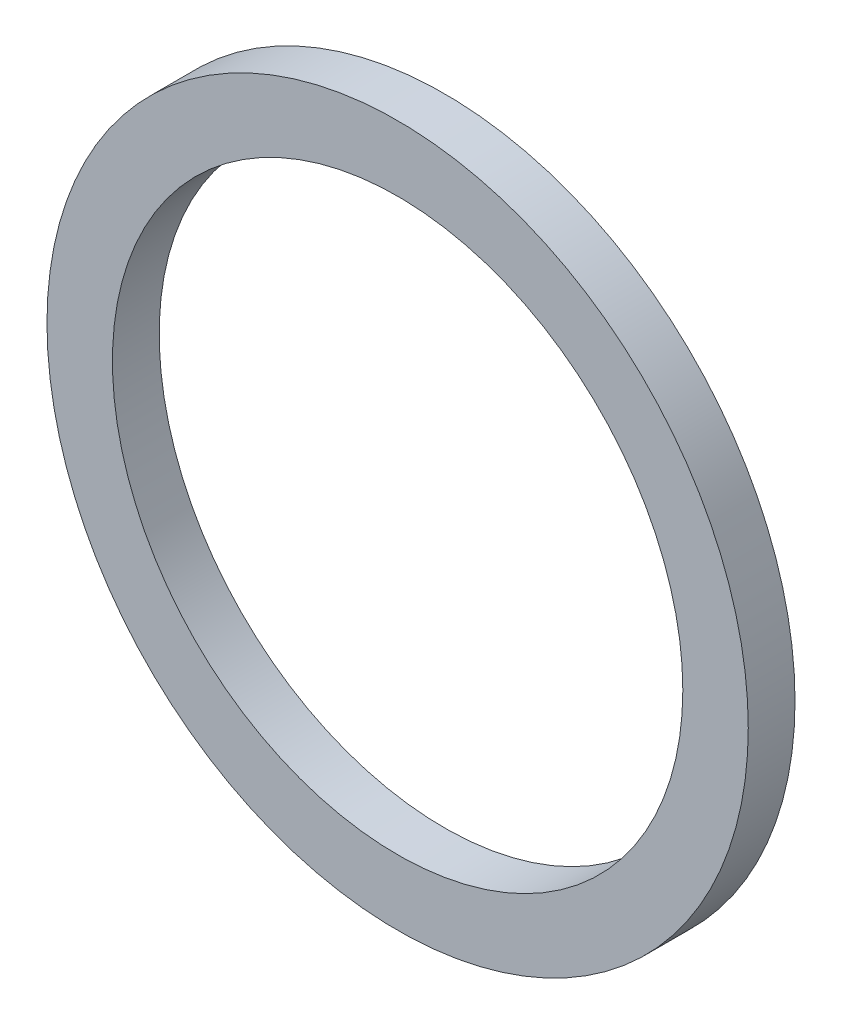
ISO-10303-21;
HEADER;
FILE_DESCRIPTION(('STEP AP214'),'2;1');
FILE_NAME('part.step','',(''),(''),'','','');
FILE_SCHEMA(('AUTOMOTIVE_DESIGN { 1 0 10303 214 1 1 1 1 }'));
ENDSEC;
DATA;
#1=APPLICATION_CONTEXT('core data for automotive mechanical design processes');
#2=APPLICATION_PROTOCOL_DEFINITION('international standard','automotive_design',2000,#1);
#3=PRODUCT_CONTEXT('',#1,'mechanical');
#4=PRODUCT('Part','Part','',(#3));
#5=PRODUCT_RELATED_PRODUCT_CATEGORY('part','',(#4));
#6=PRODUCT_DEFINITION_FORMATION('','',#4);
#7=PRODUCT_DEFINITION_CONTEXT('part definition',#1,'design');
#8=PRODUCT_DEFINITION('design','',#6,#7);
#9=PRODUCT_DEFINITION_SHAPE('','',#8);
#10=(LENGTH_UNIT() NAMED_UNIT(*) SI_UNIT(.MILLI.,.METRE.));
#11=(NAMED_UNIT(*) PLANE_ANGLE_UNIT() SI_UNIT($,.RADIAN.));
#12=(NAMED_UNIT(*) SI_UNIT($,.STERADIAN.) SOLID_ANGLE_UNIT());
#13=UNCERTAINTY_MEASURE_WITH_UNIT(LENGTH_MEASURE(1.E-05),#10,'distance_accuracy_value','');
#14=(GEOMETRIC_REPRESENTATION_CONTEXT(3) GLOBAL_UNCERTAINTY_ASSIGNED_CONTEXT((#13)) GLOBAL_UNIT_ASSIGNED_CONTEXT((#10,
#11,#12)) REPRESENTATION_CONTEXT('',''));
#15=CARTESIAN_POINT('',(0.,0.,0.));
#16=DIRECTION('',(0.,0.,1.));
#17=DIRECTION('',(1.,0.,0.));
#18=AXIS2_PLACEMENT_3D('',#15,#16,#17);
#19=CARTESIAN_POINT('',(0.,0.,2.));
#20=DIRECTION('',(0.,0.,1.));
#21=DIRECTION('',(1.,0.,0.));
#22=AXIS2_PLACEMENT_3D('',#19,#20,#21);
#23=PLANE('',#22);
#24=CARTESIAN_POINT('',(0.,0.,2.));
#25=DIRECTION('',(0.,0.,1.));
#26=DIRECTION('',(1.,0.,0.));
#27=AXIS2_PLACEMENT_3D('',#24,#25,#26);
#28=CIRCLE('',#27,15.);
#29=CARTESIAN_POINT('',(15.,0.,2.));
#30=VERTEX_POINT('',#29);
#31=EDGE_CURVE('E10',#30,#30,#28,.T.);
#32=ORIENTED_EDGE('',*,*,#31,.T.);
#33=EDGE_LOOP('',(#32));
#34=FACE_BOUND('',#33,.T.);
#35=CARTESIAN_POINT('',(0.,0.,2.));
#36=DIRECTION('',(0.,0.,1.));
#37=DIRECTION('',(1.,0.,0.));
#38=AXIS2_PLACEMENT_3D('',#35,#36,#37);
#39=CIRCLE('',#38,12.2);
#40=CARTESIAN_POINT('',(12.2,0.,2.));
#41=VERTEX_POINT('',#40);
#42=EDGE_CURVE('E43',#41,#41,#39,.T.);
#43=ORIENTED_EDGE('',*,*,#42,.F.);
#44=EDGE_LOOP('',(#43));
#45=FACE_BOUND('',#44,.T.);
#46=ADVANCED_FACE('F32',(#34,#45),#23,.T.);
#47=CARTESIAN_POINT('',(0.,0.,0.));
#48=DIRECTION('',(0.,0.,1.));
#49=DIRECTION('',(1.,0.,0.));
#50=AXIS2_PLACEMENT_3D('',#47,#48,#49);
#51=PLANE('',#50);
#52=CARTESIAN_POINT('',(0.,0.,0.));
#53=DIRECTION('',(0.,0.,1.));
#54=DIRECTION('',(1.,0.,0.));
#55=AXIS2_PLACEMENT_3D('',#52,#53,#54);
#56=CIRCLE('',#55,15.);
#57=CARTESIAN_POINT('',(15.,0.,0.));
#58=VERTEX_POINT('',#57);
#59=EDGE_CURVE('E36',#58,#58,#56,.T.);
#60=ORIENTED_EDGE('',*,*,#59,.F.);
#61=EDGE_LOOP('',(#60));
#62=FACE_BOUND('',#61,.T.);
#63=CARTESIAN_POINT('',(0.,0.,0.));
#64=DIRECTION('',(0.,0.,1.));
#65=DIRECTION('',(1.,0.,0.));
#66=AXIS2_PLACEMENT_3D('',#63,#64,#65);
#67=CIRCLE('',#66,12.2);
#68=CARTESIAN_POINT('',(12.2,0.,0.));
#69=VERTEX_POINT('',#68);
#70=EDGE_CURVE('E45',#69,#69,#67,.T.);
#71=ORIENTED_EDGE('',*,*,#70,.T.);
#72=EDGE_LOOP('',(#71));
#73=FACE_BOUND('',#72,.T.);
#74=ADVANCED_FACE('F55',(#62,#73),#51,.F.);
#75=CARTESIAN_POINT('',(0.,0.,2.));
#76=DIRECTION('',(0.,0.,-1.));
#77=DIRECTION('',(-1.,0.,0.));
#78=AXIS2_PLACEMENT_3D('',#75,#76,#77);
#79=CYLINDRICAL_SURFACE('',#78,15.);
#80=ORIENTED_EDGE('',*,*,#31,.F.);
#81=EDGE_LOOP('',(#80));
#82=FACE_BOUND('',#81,.T.);
#83=ORIENTED_EDGE('',*,*,#59,.T.);
#84=EDGE_LOOP('',(#83));
#85=FACE_BOUND('',#84,.T.);
#86=ADVANCED_FACE('F34',(#82,#85),#79,.T.);
#87=CARTESIAN_POINT('',(0.,0.,2.));
#88=DIRECTION('',(0.,0.,-1.));
#89=DIRECTION('',(-1.,0.,0.));
#90=AXIS2_PLACEMENT_3D('',#87,#88,#89);
#91=CYLINDRICAL_SURFACE('',#90,12.2);
#92=ORIENTED_EDGE('',*,*,#42,.T.);
#93=EDGE_LOOP('',(#92));
#94=FACE_BOUND('',#93,.T.);
#95=ORIENTED_EDGE('',*,*,#70,.F.);
#96=EDGE_LOOP('',(#95));
#97=FACE_BOUND('',#96,.T.);
#98=ADVANCED_FACE('F51',(#94,#97),#91,.F.);
#99=CLOSED_SHELL('',(#46,#74,#86,#98));
#100=MANIFOLD_SOLID_BREP('B2',#99);
#101=ADVANCED_BREP_SHAPE_REPRESENTATION('',(#18,#100),#14);
#102=SHAPE_DEFINITION_REPRESENTATION(#9,#101);
ENDSEC;
END-ISO-10303-21;
